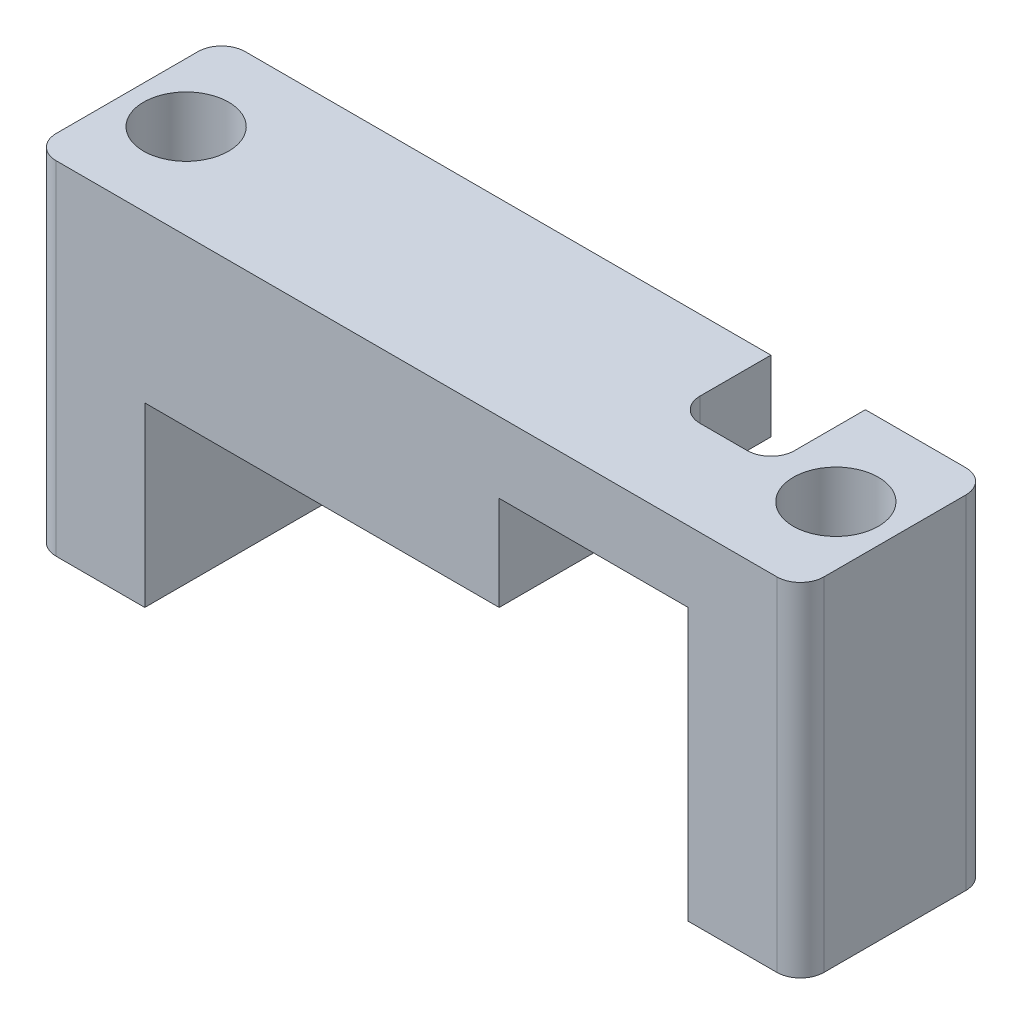
ISO-10303-21;
HEADER;
FILE_DESCRIPTION(('STEP AP214'),'2;1');
FILE_NAME('part.step','',(''),(''),'','','');
FILE_SCHEMA(('AUTOMOTIVE_DESIGN { 1 0 10303 214 1 1 1 1 }'));
ENDSEC;
DATA;
#1=APPLICATION_CONTEXT('core data for automotive mechanical design processes');
#2=APPLICATION_PROTOCOL_DEFINITION('international standard','automotive_design',2000,#1);
#3=PRODUCT_CONTEXT('',#1,'mechanical');
#4=PRODUCT('Part','Part','',(#3));
#5=PRODUCT_RELATED_PRODUCT_CATEGORY('part','',(#4));
#6=PRODUCT_DEFINITION_FORMATION('','',#4);
#7=PRODUCT_DEFINITION_CONTEXT('part definition',#1,'design');
#8=PRODUCT_DEFINITION('design','',#6,#7);
#9=PRODUCT_DEFINITION_SHAPE('','',#8);
#10=(LENGTH_UNIT() NAMED_UNIT(*) SI_UNIT(.MILLI.,.METRE.));
#11=(NAMED_UNIT(*) PLANE_ANGLE_UNIT() SI_UNIT($,.RADIAN.));
#12=(NAMED_UNIT(*) SI_UNIT($,.STERADIAN.) SOLID_ANGLE_UNIT());
#13=UNCERTAINTY_MEASURE_WITH_UNIT(LENGTH_MEASURE(1.E-05),#10,'distance_accuracy_value','');
#14=(GEOMETRIC_REPRESENTATION_CONTEXT(3) GLOBAL_UNCERTAINTY_ASSIGNED_CONTEXT((#13)) GLOBAL_UNIT_ASSIGNED_CONTEXT((#10,
#11,#12)) REPRESENTATION_CONTEXT('',''));
#15=CARTESIAN_POINT('',(0.,0.,0.));
#16=DIRECTION('',(0.,0.,1.));
#17=DIRECTION('',(1.,0.,0.));
#18=AXIS2_PLACEMENT_3D('',#15,#16,#17);
#19=CARTESIAN_POINT('',(0.,0.,0.));
#20=DIRECTION('',(0.,0.,1.));
#21=DIRECTION('',(1.,0.,0.));
#22=AXIS2_PLACEMENT_3D('',#19,#20,#21);
#23=PLANE('',#22);
#24=DIRECTION('',(1.,0.,0.));
#25=VECTOR('',#24,1.);
#26=CARTESIAN_POINT('',(3.5,4.,0.));
#27=LINE('',#26,#25);
#28=CARTESIAN_POINT('',(11.,4.,0.));
#29=VERTEX_POINT('',#28);
#30=CARTESIAN_POINT('',(11.5,4.,0.));
#31=VERTEX_POINT('',#30);
#32=EDGE_CURVE('E208',#29,#31,#27,.T.);
#33=ORIENTED_EDGE('',*,*,#32,.F.);
#34=DIRECTION('',(0.,-1.,0.));
#35=VECTOR('',#34,1.);
#36=CARTESIAN_POINT('',(11.,6.99999999999999,0.));
#37=LINE('',#36,#35);
#38=CARTESIAN_POINT('',(11.,6.99999999999999,0.));
#39=VERTEX_POINT('',#38);
#40=EDGE_CURVE('E305',#39,#29,#37,.T.);
#41=ORIENTED_EDGE('',*,*,#40,.F.);
#42=DIRECTION('',(-1.,0.,0.));
#43=VECTOR('',#42,1.);
#44=CARTESIAN_POINT('',(16.25,6.99999999999999,0.));
#45=LINE('',#44,#43);
#46=CARTESIAN_POINT('',(15.25,6.99999999999999,0.));
#47=VERTEX_POINT('',#46);
#48=EDGE_CURVE('E190',#47,#39,#45,.T.);
#49=ORIENTED_EDGE('',*,*,#48,.F.);
#50=DIRECTION('',(0.,1.,0.));
#51=VECTOR('',#50,1.);
#52=CARTESIAN_POINT('',(15.25,0.,0.));
#53=LINE('',#52,#51);
#54=CARTESIAN_POINT('',(15.25,-7.50000000000001,0.));
#55=VERTEX_POINT('',#54);
#56=EDGE_CURVE('E261',#47,#55,#53,.F.);
#57=ORIENTED_EDGE('',*,*,#56,.T.);
#58=DIRECTION('',(1.,0.,0.));
#59=VECTOR('',#58,1.);
#60=CARTESIAN_POINT('',(11.5,-7.50000000000001,0.));
#61=LINE('',#60,#59);
#62=CARTESIAN_POINT('',(11.5,-7.50000000000001,0.));
#63=VERTEX_POINT('',#62);
#64=EDGE_CURVE('E213',#63,#55,#61,.T.);
#65=ORIENTED_EDGE('',*,*,#64,.F.);
#66=DIRECTION('',(0.,-1.,0.));
#67=VECTOR('',#66,1.);
#68=CARTESIAN_POINT('',(11.5,4.,0.));
#69=LINE('',#68,#67);
#70=EDGE_CURVE('E211',#31,#63,#69,.T.);
#71=ORIENTED_EDGE('',*,*,#70,.F.);
#72=EDGE_LOOP('',(#33,#41,#49,#57,#65,#71));
#73=FACE_BOUND('',#72,.T.);
#74=ADVANCED_FACE('F32',(#73),#23,.F.);
#75=CARTESIAN_POINT('',(16.25,6.99999999999999,8.00000000000001));
#76=DIRECTION('',(0.,-1.,0.));
#77=DIRECTION('',(0.,0.,-1.));
#78=AXIS2_PLACEMENT_3D('',#75,#76,#77);
#79=PLANE('',#78);
#80=ORIENTED_EDGE('',*,*,#48,.T.);
#81=DIRECTION('',(0.,0.,-1.));
#82=VECTOR('',#81,1.);
#83=CARTESIAN_POINT('',(11.,6.99999999999999,4.00000000000001));
#84=LINE('',#83,#82);
#85=CARTESIAN_POINT('',(11.,6.99999999999988,3.));
#86=VERTEX_POINT('',#85);
#87=EDGE_CURVE('E172',#86,#39,#84,.T.);
#88=ORIENTED_EDGE('',*,*,#87,.F.);
#89=CARTESIAN_POINT('',(9.99999999999999,6.99999999999988,3.));
#90=DIRECTION('',(0.,-1.,0.));
#91=DIRECTION('',(0.,0.,-1.));
#92=AXIS2_PLACEMENT_3D('',#89,#90,#91);
#93=CIRCLE('',#92,1.);
#94=CARTESIAN_POINT('',(9.99999999999999,6.99999999999999,4.00000000000001));
#95=VERTEX_POINT('',#94);
#96=EDGE_CURVE('E294',#86,#95,#93,.T.);
#97=ORIENTED_EDGE('',*,*,#96,.T.);
#98=DIRECTION('',(1.,0.,0.));
#99=VECTOR('',#98,1.);
#100=CARTESIAN_POINT('',(11.,6.99999999999999,4.00000000000001));
#101=LINE('',#100,#99);
#102=CARTESIAN_POINT('',(8.00000000000002,6.99999999999999,3.99999999999999));
#103=VERTEX_POINT('',#102);
#104=EDGE_CURVE('E173',#103,#95,#101,.T.);
#105=ORIENTED_EDGE('',*,*,#104,.F.);
#106=CARTESIAN_POINT('',(7.99999999999999,6.99999999999988,3.));
#107=DIRECTION('',(0.,-1.,0.));
#108=DIRECTION('',(0.,0.,-1.));
#109=AXIS2_PLACEMENT_3D('',#106,#107,#108);
#110=CIRCLE('',#109,1.);
#111=CARTESIAN_POINT('',(6.99999999999999,6.99999999999988,3.));
#112=VERTEX_POINT('',#111);
#113=EDGE_CURVE('E40',#103,#112,#110,.T.);
#114=ORIENTED_EDGE('',*,*,#113,.T.);
#115=DIRECTION('',(0.,0.,-1.));
#116=VECTOR('',#115,1.);
#117=CARTESIAN_POINT('',(7.00000000000002,6.99999999999999,4.));
#118=LINE('',#117,#116);
#119=CARTESIAN_POINT('',(7.00000000000001,6.99999999999999,0.));
#120=VERTEX_POINT('',#119);
#121=EDGE_CURVE('E164',#112,#120,#118,.T.);
#122=ORIENTED_EDGE('',*,*,#121,.T.);
#123=CARTESIAN_POINT('',(-15.25,6.99999999999999,0.));
#124=VERTEX_POINT('',#123);
#125=EDGE_CURVE('E170',#120,#124,#45,.T.);
#126=ORIENTED_EDGE('',*,*,#125,.T.);
#127=CARTESIAN_POINT('',(-15.25,6.99999999999999,1.));
#128=DIRECTION('',(0.,-1.,0.));
#129=DIRECTION('',(0.,0.,-1.));
#130=AXIS2_PLACEMENT_3D('',#127,#128,#129);
#131=CIRCLE('',#130,1.);
#132=CARTESIAN_POINT('',(-16.25,6.99999999999999,1.));
#133=VERTEX_POINT('',#132);
#134=EDGE_CURVE('E254',#124,#133,#131,.F.);
#135=ORIENTED_EDGE('',*,*,#134,.T.);
#136=DIRECTION('',(0.,0.,-1.));
#137=VECTOR('',#136,1.);
#138=CARTESIAN_POINT('',(-16.25,6.99999999999999,8.00000000000001));
#139=LINE('',#138,#137);
#140=CARTESIAN_POINT('',(-16.25,6.99999999999988,7.00000000000001));
#141=VERTEX_POINT('',#140);
#142=EDGE_CURVE('E241',#141,#133,#139,.T.);
#143=ORIENTED_EDGE('',*,*,#142,.F.);
#144=CARTESIAN_POINT('',(-15.25,6.99999999999988,7.00000000000001));
#145=DIRECTION('',(0.,-1.,0.));
#146=DIRECTION('',(0.,0.,-1.));
#147=AXIS2_PLACEMENT_3D('',#144,#145,#146);
#148=CIRCLE('',#147,1.);
#149=CARTESIAN_POINT('',(-15.25,6.99999999999999,8.00000000000001));
#150=VERTEX_POINT('',#149);
#151=EDGE_CURVE('E252',#141,#150,#148,.F.);
#152=ORIENTED_EDGE('',*,*,#151,.T.);
#153=DIRECTION('',(-1.,0.,0.));
#154=VECTOR('',#153,1.);
#155=CARTESIAN_POINT('',(16.25,6.99999999999999,8.00000000000001));
#156=LINE('',#155,#154);
#157=CARTESIAN_POINT('',(15.25,6.99999999999999,8.00000000000001));
#158=VERTEX_POINT('',#157);
#159=EDGE_CURVE('E216',#158,#150,#156,.T.);
#160=ORIENTED_EDGE('',*,*,#159,.F.);
#161=CARTESIAN_POINT('',(15.25,6.99999999999988,7.));
#162=DIRECTION('',(0.,-1.,0.));
#163=DIRECTION('',(0.,0.,-1.));
#164=AXIS2_PLACEMENT_3D('',#161,#162,#163);
#165=CIRCLE('',#164,1.);
#166=CARTESIAN_POINT('',(16.25,6.99999999999988,7.));
#167=VERTEX_POINT('',#166);
#168=EDGE_CURVE('E256',#158,#167,#165,.F.);
#169=ORIENTED_EDGE('',*,*,#168,.T.);
#170=DIRECTION('',(0.,0.,-1.));
#171=VECTOR('',#170,1.);
#172=CARTESIAN_POINT('',(16.25,6.99999999999999,8.00000000000001));
#173=LINE('',#172,#171);
#174=CARTESIAN_POINT('',(16.25,6.99999999999999,1.));
#175=VERTEX_POINT('',#174);
#176=EDGE_CURVE('E244',#167,#175,#173,.T.);
#177=ORIENTED_EDGE('',*,*,#176,.T.);
#178=CARTESIAN_POINT('',(15.25,6.99999999999999,1.));
#179=DIRECTION('',(0.,-1.,0.));
#180=DIRECTION('',(0.,0.,-1.));
#181=AXIS2_PLACEMENT_3D('',#178,#179,#180);
#182=CIRCLE('',#181,1.);
#183=EDGE_CURVE('E258',#175,#47,#182,.F.);
#184=ORIENTED_EDGE('',*,*,#183,.T.);
#185=EDGE_LOOP('',(#80,#88,#97,#105,#114,#122,#126,#135,#143,#152,#160,#169,#177,#184));
#186=FACE_BOUND('',#185,.T.);
#187=CARTESIAN_POINT('',(13.75,7.00000000000001,3.99999999999999));
#188=DIRECTION('',(0.,1.,0.));
#189=DIRECTION('',(0.,0.,1.));
#190=AXIS2_PLACEMENT_3D('',#187,#188,#189);
#191=CIRCLE('',#190,1.79999999999999);
#192=CARTESIAN_POINT('',(13.75,7.00000000000001,5.79999999999998));
#193=VERTEX_POINT('',#192);
#194=EDGE_CURVE('E317',#193,#193,#191,.T.);
#195=ORIENTED_EDGE('',*,*,#194,.F.);
#196=EDGE_LOOP('',(#195));
#197=FACE_BOUND('',#196,.T.);
#198=CARTESIAN_POINT('',(-13.75,7.00000000000001,4.));
#199=DIRECTION('',(0.,1.,0.));
#200=DIRECTION('',(0.,0.,1.));
#201=AXIS2_PLACEMENT_3D('',#198,#199,#200);
#202=CIRCLE('',#201,1.79999999999999);
#203=CARTESIAN_POINT('',(-13.75,7.00000000000001,5.79999999999999));
#204=VERTEX_POINT('',#203);
#205=EDGE_CURVE('E195',#204,#204,#202,.T.);
#206=ORIENTED_EDGE('',*,*,#205,.F.);
#207=EDGE_LOOP('',(#206));
#208=FACE_BOUND('',#207,.T.);
#209=ADVANCED_FACE('F167',(#186,#197,#208),#79,.F.);
#210=CARTESIAN_POINT('',(16.25,-7.50000000000001,8.00000000000001));
#211=DIRECTION('',(-1.,0.,0.));
#212=DIRECTION('',(0.,0.,1.));
#213=AXIS2_PLACEMENT_3D('',#210,#211,#212);
#214=PLANE('',#213);
#215=DIRECTION('',(0.,0.,-1.));
#216=VECTOR('',#215,1.);
#217=CARTESIAN_POINT('',(16.25,-7.50000000000001,8.00000000000001));
#218=LINE('',#217,#216);
#219=CARTESIAN_POINT('',(16.25,-7.50000000000012,7.));
#220=VERTEX_POINT('',#219);
#221=CARTESIAN_POINT('',(16.25,-7.50000000000001,1.));
#222=VERTEX_POINT('',#221);
#223=EDGE_CURVE('E217',#220,#222,#218,.T.);
#224=ORIENTED_EDGE('',*,*,#223,.T.);
#225=DIRECTION('',(0.,1.,0.));
#226=VECTOR('',#225,1.);
#227=CARTESIAN_POINT('',(16.25,-7.50000000000001,1.));
#228=LINE('',#227,#226);
#229=EDGE_CURVE('E249',#222,#175,#228,.T.);
#230=ORIENTED_EDGE('',*,*,#229,.T.);
#231=ORIENTED_EDGE('',*,*,#176,.F.);
#232=DIRECTION('',(0.,1.,0.));
#233=VECTOR('',#232,1.);
#234=CARTESIAN_POINT('',(16.25,-7.50000000000012,7.));
#235=LINE('',#234,#233);
#236=EDGE_CURVE('E247',#167,#220,#235,.F.);
#237=ORIENTED_EDGE('',*,*,#236,.T.);
#238=EDGE_LOOP('',(#224,#230,#231,#237));
#239=FACE_BOUND('',#238,.T.);
#240=ADVANCED_FACE('F355',(#239),#214,.F.);
#241=CARTESIAN_POINT('',(-16.25,6.99999999999999,8.00000000000001));
#242=DIRECTION('',(1.,0.,0.));
#243=DIRECTION('',(0.,0.,-1.));
#244=AXIS2_PLACEMENT_3D('',#241,#242,#243);
#245=PLANE('',#244);
#246=ORIENTED_EDGE('',*,*,#142,.T.);
#247=DIRECTION('',(0.,-1.,0.));
#248=VECTOR('',#247,1.);
#249=CARTESIAN_POINT('',(-16.25,6.99999999999999,1.));
#250=LINE('',#249,#248);
#251=CARTESIAN_POINT('',(-16.25,-7.50000000000001,1.));
#252=VERTEX_POINT('',#251);
#253=EDGE_CURVE('E275',#133,#252,#250,.T.);
#254=ORIENTED_EDGE('',*,*,#253,.T.);
#255=DIRECTION('',(0.,0.,-1.));
#256=VECTOR('',#255,1.);
#257=CARTESIAN_POINT('',(-16.25,-7.50000000000001,8.00000000000001));
#258=LINE('',#257,#256);
#259=CARTESIAN_POINT('',(-16.25,-7.50000000000012,7.00000000000001));
#260=VERTEX_POINT('',#259);
#261=EDGE_CURVE('E238',#260,#252,#258,.T.);
#262=ORIENTED_EDGE('',*,*,#261,.F.);
#263=DIRECTION('',(0.,-1.,0.));
#264=VECTOR('',#263,1.);
#265=CARTESIAN_POINT('',(-16.25,6.99999999999988,7.00000000000001));
#266=LINE('',#265,#264);
#267=EDGE_CURVE('E273',#260,#141,#266,.F.);
#268=ORIENTED_EDGE('',*,*,#267,.T.);
#269=EDGE_LOOP('',(#246,#254,#262,#268));
#270=FACE_BOUND('',#269,.T.);
#271=ADVANCED_FACE('F451',(#270),#245,.F.);
#272=CARTESIAN_POINT('',(-16.25,-7.50000000000001,8.00000000000001));
#273=DIRECTION('',(0.,1.,0.));
#274=DIRECTION('',(0.,0.,1.));
#275=AXIS2_PLACEMENT_3D('',#272,#273,#274);
#276=PLANE('',#275);
#277=CARTESIAN_POINT('',(-13.75,-7.50000000000001,4.));
#278=DIRECTION('',(0.,1.,0.));
#279=DIRECTION('',(0.,0.,1.));
#280=AXIS2_PLACEMENT_3D('',#277,#278,#279);
#281=CIRCLE('',#280,1.79999999999999);
#282=CARTESIAN_POINT('',(-13.75,-7.50000000000001,5.8));
#283=VERTEX_POINT('',#282);
#284=EDGE_CURVE('E191',#283,#283,#281,.T.);
#285=ORIENTED_EDGE('',*,*,#284,.T.);
#286=EDGE_LOOP('',(#285));
#287=FACE_BOUND('',#286,.T.);
#288=ORIENTED_EDGE('',*,*,#261,.T.);
#289=CARTESIAN_POINT('',(-15.25,-7.50000000000001,1.));
#290=DIRECTION('',(0.,1.,0.));
#291=DIRECTION('',(0.,0.,1.));
#292=AXIS2_PLACEMENT_3D('',#289,#290,#291);
#293=CIRCLE('',#292,1.);
#294=CARTESIAN_POINT('',(-15.25,-7.50000000000001,0.));
#295=VERTEX_POINT('',#294);
#296=EDGE_CURVE('E183',#252,#295,#293,.F.);
#297=ORIENTED_EDGE('',*,*,#296,.T.);
#298=DIRECTION('',(1.,0.,0.));
#299=VECTOR('',#298,1.);
#300=CARTESIAN_POINT('',(-16.25,-7.50000000000001,0.));
#301=LINE('',#300,#299);
#302=CARTESIAN_POINT('',(-11.5,-7.50000000000001,0.));
#303=VERTEX_POINT('',#302);
#304=EDGE_CURVE('E193',#295,#303,#301,.T.);
#305=ORIENTED_EDGE('',*,*,#304,.T.);
#306=DIRECTION('',(0.,0.,-1.));
#307=VECTOR('',#306,1.);
#308=CARTESIAN_POINT('',(-11.5,-7.50000000000001,8.00000000000001));
#309=LINE('',#308,#307);
#310=CARTESIAN_POINT('',(-11.5,-7.50000000000001,8.00000000000001));
#311=VERTEX_POINT('',#310);
#312=EDGE_CURVE('E235',#311,#303,#309,.T.);
#313=ORIENTED_EDGE('',*,*,#312,.F.);
#314=DIRECTION('',(1.,0.,0.));
#315=VECTOR('',#314,1.);
#316=CARTESIAN_POINT('',(-16.25,-7.50000000000001,8.00000000000001));
#317=LINE('',#316,#315);
#318=CARTESIAN_POINT('',(-15.25,-7.50000000000001,8.00000000000001));
#319=VERTEX_POINT('',#318);
#320=EDGE_CURVE('E330',#319,#311,#317,.T.);
#321=ORIENTED_EDGE('',*,*,#320,.F.);
#322=CARTESIAN_POINT('',(-15.25,-7.50000000000012,7.00000000000001));
#323=DIRECTION('',(0.,1.,0.));
#324=DIRECTION('',(0.,0.,1.));
#325=AXIS2_PLACEMENT_3D('',#322,#323,#324);
#326=CIRCLE('',#325,1.);
#327=EDGE_CURVE('E278',#319,#260,#326,.F.);
#328=ORIENTED_EDGE('',*,*,#327,.T.);
#329=EDGE_LOOP('',(#288,#297,#305,#313,#321,#328));
#330=FACE_BOUND('',#329,.T.);
#331=ADVANCED_FACE('F456',(#287,#330),#276,.F.);
#332=CARTESIAN_POINT('',(-11.5,-7.50000000000001,8.00000000000001));
#333=DIRECTION('',(-1.,0.,0.));
#334=DIRECTION('',(0.,-1.,0.));
#335=AXIS2_PLACEMENT_3D('',#332,#333,#334);
#336=PLANE('',#335);
#337=DIRECTION('',(0.,1.,0.));
#338=VECTOR('',#337,1.);
#339=CARTESIAN_POINT('',(-11.5,-7.50000000000001,0.));
#340=LINE('',#339,#338);
#341=CARTESIAN_POINT('',(-11.5,0.,0.));
#342=VERTEX_POINT('',#341);
#343=EDGE_CURVE('E202',#303,#342,#340,.T.);
#344=ORIENTED_EDGE('',*,*,#343,.T.);
#345=DIRECTION('',(0.,0.,-1.));
#346=VECTOR('',#345,1.);
#347=CARTESIAN_POINT('',(-11.5,0.,8.00000000000001));
#348=LINE('',#347,#346);
#349=CARTESIAN_POINT('',(-11.5,0.,8.00000000000001));
#350=VERTEX_POINT('',#349);
#351=EDGE_CURVE('E232',#350,#342,#348,.T.);
#352=ORIENTED_EDGE('',*,*,#351,.F.);
#353=DIRECTION('',(0.,1.,0.));
#354=VECTOR('',#353,1.);
#355=CARTESIAN_POINT('',(-11.5,-7.50000000000001,8.00000000000001));
#356=LINE('',#355,#354);
#357=EDGE_CURVE('E332',#311,#350,#356,.T.);
#358=ORIENTED_EDGE('',*,*,#357,.F.);
#359=ORIENTED_EDGE('',*,*,#312,.T.);
#360=EDGE_LOOP('',(#344,#352,#358,#359));
#361=FACE_BOUND('',#360,.T.);
#362=ADVANCED_FACE('F445',(#361),#336,.F.);
#363=CARTESIAN_POINT('',(-11.5,0.,8.00000000000001));
#364=DIRECTION('',(0.,1.,0.));
#365=DIRECTION('',(0.,0.,1.));
#366=AXIS2_PLACEMENT_3D('',#363,#364,#365);
#367=PLANE('',#366);
#368=DIRECTION('',(1.,0.,0.));
#369=VECTOR('',#368,1.);
#370=CARTESIAN_POINT('',(-11.5,0.,0.));
#371=LINE('',#370,#369);
#372=CARTESIAN_POINT('',(3.5,0.,0.));
#373=VERTEX_POINT('',#372);
#374=EDGE_CURVE('E204',#342,#373,#371,.T.);
#375=ORIENTED_EDGE('',*,*,#374,.T.);
#376=DIRECTION('',(0.,0.,-1.));
#377=VECTOR('',#376,1.);
#378=CARTESIAN_POINT('',(3.5,0.,8.00000000000001));
#379=LINE('',#378,#377);
#380=CARTESIAN_POINT('',(3.5,0.,8.00000000000001));
#381=VERTEX_POINT('',#380);
#382=EDGE_CURVE('E229',#381,#373,#379,.T.);
#383=ORIENTED_EDGE('',*,*,#382,.F.);
#384=DIRECTION('',(1.,0.,0.));
#385=VECTOR('',#384,1.);
#386=CARTESIAN_POINT('',(-11.5,0.,8.00000000000001));
#387=LINE('',#386,#385);
#388=EDGE_CURVE('E334',#350,#381,#387,.T.);
#389=ORIENTED_EDGE('',*,*,#388,.F.);
#390=ORIENTED_EDGE('',*,*,#351,.T.);
#391=EDGE_LOOP('',(#375,#383,#389,#390));
#392=FACE_BOUND('',#391,.T.);
#393=ADVANCED_FACE('F441',(#392),#367,.F.);
#394=CARTESIAN_POINT('',(3.5,0.,8.00000000000001));
#395=DIRECTION('',(-1.,0.,0.));
#396=DIRECTION('',(0.,-1.,0.));
#397=AXIS2_PLACEMENT_3D('',#394,#395,#396);
#398=PLANE('',#397);
#399=DIRECTION('',(0.,1.,0.));
#400=VECTOR('',#399,1.);
#401=CARTESIAN_POINT('',(3.5,0.,0.));
#402=LINE('',#401,#400);
#403=CARTESIAN_POINT('',(3.5,4.,0.));
#404=VERTEX_POINT('',#403);
#405=EDGE_CURVE('E206',#373,#404,#402,.T.);
#406=ORIENTED_EDGE('',*,*,#405,.T.);
#407=DIRECTION('',(0.,0.,-1.));
#408=VECTOR('',#407,1.);
#409=CARTESIAN_POINT('',(3.5,4.,8.00000000000001));
#410=LINE('',#409,#408);
#411=CARTESIAN_POINT('',(3.5,4.,8.00000000000001));
#412=VERTEX_POINT('',#411);
#413=EDGE_CURVE('E226',#412,#404,#410,.T.);
#414=ORIENTED_EDGE('',*,*,#413,.F.);
#415=DIRECTION('',(0.,1.,0.));
#416=VECTOR('',#415,1.);
#417=CARTESIAN_POINT('',(3.5,0.,8.00000000000001));
#418=LINE('',#417,#416);
#419=EDGE_CURVE('E336',#381,#412,#418,.T.);
#420=ORIENTED_EDGE('',*,*,#419,.F.);
#421=ORIENTED_EDGE('',*,*,#382,.T.);
#422=EDGE_LOOP('',(#406,#414,#420,#421));
#423=FACE_BOUND('',#422,.T.);
#424=ADVANCED_FACE('F436',(#423),#398,.F.);
#425=CARTESIAN_POINT('',(3.5,4.,8.00000000000001));
#426=DIRECTION('',(0.,1.,0.));
#427=DIRECTION('',(0.,0.,1.));
#428=AXIS2_PLACEMENT_3D('',#425,#426,#427);
#429=PLANE('',#428);
#430=DIRECTION('',(-1.,0.,0.));
#431=VECTOR('',#430,1.);
#432=CARTESIAN_POINT('',(3.50000000000002,4.,4.));
#433=LINE('',#432,#431);
#434=CARTESIAN_POINT('',(9.99999999999999,4.,4.00000000000001));
#435=VERTEX_POINT('',#434);
#436=CARTESIAN_POINT('',(8.00000000000002,4.,3.99999999999999));
#437=VERTEX_POINT('',#436);
#438=EDGE_CURVE('E182',#435,#437,#433,.T.);
#439=ORIENTED_EDGE('',*,*,#438,.F.);
#440=CARTESIAN_POINT('',(9.99999999999999,3.99999999999989,3.));
#441=DIRECTION('',(0.,1.,0.));
#442=DIRECTION('',(0.,0.,1.));
#443=AXIS2_PLACEMENT_3D('',#440,#441,#442);
#444=CIRCLE('',#443,1.);
#445=CARTESIAN_POINT('',(11.,3.99999999999989,3.));
#446=VERTEX_POINT('',#445);
#447=EDGE_CURVE('E292',#435,#446,#444,.T.);
#448=ORIENTED_EDGE('',*,*,#447,.T.);
#449=DIRECTION('',(0.,0.,-1.));
#450=VECTOR('',#449,1.);
#451=CARTESIAN_POINT('',(11.,4.,8.00000000000001));
#452=LINE('',#451,#450);
#453=EDGE_CURVE('E311',#446,#29,#452,.T.);
#454=ORIENTED_EDGE('',*,*,#453,.T.);
#455=ORIENTED_EDGE('',*,*,#32,.T.);
#456=DIRECTION('',(0.,0.,-1.));
#457=VECTOR('',#456,1.);
#458=CARTESIAN_POINT('',(11.5,4.,8.00000000000001));
#459=LINE('',#458,#457);
#460=CARTESIAN_POINT('',(11.5,4.,8.00000000000001));
#461=VERTEX_POINT('',#460);
#462=EDGE_CURVE('E223',#461,#31,#459,.T.);
#463=ORIENTED_EDGE('',*,*,#462,.F.);
#464=DIRECTION('',(1.,0.,0.));
#465=VECTOR('',#464,1.);
#466=CARTESIAN_POINT('',(3.5,4.,8.00000000000001));
#467=LINE('',#466,#465);
#468=EDGE_CURVE('E338',#412,#461,#467,.T.);
#469=ORIENTED_EDGE('',*,*,#468,.F.);
#470=ORIENTED_EDGE('',*,*,#413,.T.);
#471=CARTESIAN_POINT('',(7.00000000000001,4.,0.));
#472=VERTEX_POINT('',#471);
#473=EDGE_CURVE('E209',#404,#472,#27,.T.);
#474=ORIENTED_EDGE('',*,*,#473,.T.);
#475=DIRECTION('',(0.,0.,1.));
#476=VECTOR('',#475,1.);
#477=CARTESIAN_POINT('',(7.00000000000001,4.,8.00000000000001));
#478=LINE('',#477,#476);
#479=CARTESIAN_POINT('',(6.99999999999999,3.99999999999989,3.00000000000001));
#480=VERTEX_POINT('',#479);
#481=EDGE_CURVE('E178',#472,#480,#478,.T.);
#482=ORIENTED_EDGE('',*,*,#481,.T.);
#483=CARTESIAN_POINT('',(7.99999999999999,3.99999999999989,3.00000000000001));
#484=DIRECTION('',(0.,1.,0.));
#485=DIRECTION('',(0.,0.,1.));
#486=AXIS2_PLACEMENT_3D('',#483,#484,#485);
#487=CIRCLE('',#486,1.);
#488=EDGE_CURVE('E11',#480,#437,#487,.T.);
#489=ORIENTED_EDGE('',*,*,#488,.T.);
#490=EDGE_LOOP('',(#439,#448,#454,#455,#463,#469,#470,#474,#482,#489));
#491=FACE_BOUND('',#490,.T.);
#492=ADVANCED_FACE('F310',(#491),#429,.F.);
#493=CARTESIAN_POINT('',(11.5,4.,8.00000000000001));
#494=DIRECTION('',(1.,0.,0.));
#495=DIRECTION('',(0.,1.,0.));
#496=AXIS2_PLACEMENT_3D('',#493,#494,#495);
#497=PLANE('',#496);
#498=ORIENTED_EDGE('',*,*,#70,.T.);
#499=DIRECTION('',(0.,0.,-1.));
#500=VECTOR('',#499,1.);
#501=CARTESIAN_POINT('',(11.5,-7.50000000000001,8.00000000000001));
#502=LINE('',#501,#500);
#503=CARTESIAN_POINT('',(11.5,-7.50000000000001,8.00000000000001));
#504=VERTEX_POINT('',#503);
#505=EDGE_CURVE('E220',#504,#63,#502,.T.);
#506=ORIENTED_EDGE('',*,*,#505,.F.);
#507=DIRECTION('',(0.,-1.,0.));
#508=VECTOR('',#507,1.);
#509=CARTESIAN_POINT('',(11.5,4.,8.00000000000001));
#510=LINE('',#509,#508);
#511=EDGE_CURVE('E339',#461,#504,#510,.T.);
#512=ORIENTED_EDGE('',*,*,#511,.F.);
#513=ORIENTED_EDGE('',*,*,#462,.T.);
#514=EDGE_LOOP('',(#498,#506,#512,#513));
#515=FACE_BOUND('',#514,.T.);
#516=ADVANCED_FACE('F371',(#515),#497,.F.);
#517=CARTESIAN_POINT('',(11.5,-7.50000000000001,8.00000000000001));
#518=DIRECTION('',(0.,1.,0.));
#519=DIRECTION('',(0.,0.,1.));
#520=AXIS2_PLACEMENT_3D('',#517,#518,#519);
#521=PLANE('',#520);
#522=CARTESIAN_POINT('',(13.75,-7.50000000000001,3.99999999999999));
#523=DIRECTION('',(0.,1.,0.));
#524=DIRECTION('',(0.,0.,1.));
#525=AXIS2_PLACEMENT_3D('',#522,#523,#524);
#526=CIRCLE('',#525,1.79999999999999);
#527=CARTESIAN_POINT('',(13.75,-7.50000000000001,5.79999999999999));
#528=VERTEX_POINT('',#527);
#529=EDGE_CURVE('E320',#528,#528,#526,.T.);
#530=ORIENTED_EDGE('',*,*,#529,.T.);
#531=EDGE_LOOP('',(#530));
#532=FACE_BOUND('',#531,.T.);
#533=ORIENTED_EDGE('',*,*,#64,.T.);
#534=CARTESIAN_POINT('',(15.25,-7.50000000000001,1.));
#535=DIRECTION('',(0.,1.,0.));
#536=DIRECTION('',(0.,0.,1.));
#537=AXIS2_PLACEMENT_3D('',#534,#535,#536);
#538=CIRCLE('',#537,1.);
#539=EDGE_CURVE('E265',#55,#222,#538,.F.);
#540=ORIENTED_EDGE('',*,*,#539,.T.);
#541=ORIENTED_EDGE('',*,*,#223,.F.);
#542=CARTESIAN_POINT('',(15.25,-7.50000000000012,7.));
#543=DIRECTION('',(0.,1.,0.));
#544=DIRECTION('',(0.,0.,1.));
#545=AXIS2_PLACEMENT_3D('',#542,#543,#544);
#546=CIRCLE('',#545,1.);
#547=CARTESIAN_POINT('',(15.25,-7.50000000000001,8.00000000000001));
#548=VERTEX_POINT('',#547);
#549=EDGE_CURVE('E263',#220,#548,#546,.F.);
#550=ORIENTED_EDGE('',*,*,#549,.T.);
#551=DIRECTION('',(1.,0.,0.));
#552=VECTOR('',#551,1.);
#553=CARTESIAN_POINT('',(11.5,-7.50000000000001,8.00000000000001));
#554=LINE('',#553,#552);
#555=EDGE_CURVE('E199',#504,#548,#554,.T.);
#556=ORIENTED_EDGE('',*,*,#555,.F.);
#557=ORIENTED_EDGE('',*,*,#505,.T.);
#558=EDGE_LOOP('',(#533,#540,#541,#550,#556,#557));
#559=FACE_BOUND('',#558,.T.);
#560=ADVANCED_FACE('F372',(#532,#559),#521,.F.);
#561=CARTESIAN_POINT('',(0.,0.,8.00000000000001));
#562=DIRECTION('',(0.,0.,1.));
#563=DIRECTION('',(1.,0.,0.));
#564=AXIS2_PLACEMENT_3D('',#561,#562,#563);
#565=PLANE('',#564);
#566=ORIENTED_EDGE('',*,*,#555,.T.);
#567=DIRECTION('',(0.,1.,0.));
#568=VECTOR('',#567,1.);
#569=CARTESIAN_POINT('',(15.25,6.99999999999999,8.00000000000001));
#570=LINE('',#569,#568);
#571=EDGE_CURVE('E270',#548,#158,#570,.T.);
#572=ORIENTED_EDGE('',*,*,#571,.T.);
#573=ORIENTED_EDGE('',*,*,#159,.T.);
#574=DIRECTION('',(0.,-1.,0.));
#575=VECTOR('',#574,1.);
#576=CARTESIAN_POINT('',(-15.25,-7.50000000000001,8.00000000000001));
#577=LINE('',#576,#575);
#578=EDGE_CURVE('E267',#150,#319,#577,.T.);
#579=ORIENTED_EDGE('',*,*,#578,.T.);
#580=ORIENTED_EDGE('',*,*,#320,.T.);
#581=ORIENTED_EDGE('',*,*,#357,.T.);
#582=ORIENTED_EDGE('',*,*,#388,.T.);
#583=ORIENTED_EDGE('',*,*,#419,.T.);
#584=ORIENTED_EDGE('',*,*,#468,.T.);
#585=ORIENTED_EDGE('',*,*,#511,.T.);
#586=EDGE_LOOP('',(#566,#572,#573,#579,#580,#581,#582,#583,#584,#585));
#587=FACE_BOUND('',#586,.T.);
#588=ADVANCED_FACE('F346',(#587),#565,.T.);
#589=ORIENTED_EDGE('',*,*,#125,.F.);
#590=DIRECTION('',(0.,-1.,0.));
#591=VECTOR('',#590,1.);
#592=CARTESIAN_POINT('',(7.00000000000001,0.,0.));
#593=LINE('',#592,#591);
#594=EDGE_CURVE('E176',#120,#472,#593,.T.);
#595=ORIENTED_EDGE('',*,*,#594,.T.);
#596=ORIENTED_EDGE('',*,*,#473,.F.);
#597=ORIENTED_EDGE('',*,*,#405,.F.);
#598=ORIENTED_EDGE('',*,*,#374,.F.);
#599=ORIENTED_EDGE('',*,*,#343,.F.);
#600=ORIENTED_EDGE('',*,*,#304,.F.);
#601=DIRECTION('',(0.,-1.,0.));
#602=VECTOR('',#601,1.);
#603=CARTESIAN_POINT('',(-15.25,0.,0.));
#604=LINE('',#603,#602);
#605=EDGE_CURVE('E188',#295,#124,#604,.F.);
#606=ORIENTED_EDGE('',*,*,#605,.T.);
#607=EDGE_LOOP('',(#589,#595,#596,#597,#598,#599,#600,#606));
#608=FACE_BOUND('',#607,.T.);
#609=ADVANCED_FACE('F185',(#608),#23,.F.);
#610=CARTESIAN_POINT('',(-13.75,6.99999999999999,4.));
#611=DIRECTION('',(0.,1.,0.));
#612=DIRECTION('',(0.,0.,1.));
#613=AXIS2_PLACEMENT_3D('',#610,#611,#612);
#614=CYLINDRICAL_SURFACE('',#613,1.79999999999999);
#615=ORIENTED_EDGE('',*,*,#284,.F.);
#616=EDGE_LOOP('',(#615));
#617=FACE_BOUND('',#616,.T.);
#618=ORIENTED_EDGE('',*,*,#205,.T.);
#619=EDGE_LOOP('',(#618));
#620=FACE_BOUND('',#619,.T.);
#621=ADVANCED_FACE('F389',(#617,#620),#614,.F.);
#622=CARTESIAN_POINT('',(13.75,6.99999999999999,3.99999999999999));
#623=DIRECTION('',(0.,1.,0.));
#624=DIRECTION('',(0.,0.,1.));
#625=AXIS2_PLACEMENT_3D('',#622,#623,#624);
#626=CYLINDRICAL_SURFACE('',#625,1.79999999999999);
#627=ORIENTED_EDGE('',*,*,#529,.F.);
#628=EDGE_LOOP('',(#627));
#629=FACE_BOUND('',#628,.T.);
#630=ORIENTED_EDGE('',*,*,#194,.T.);
#631=EDGE_LOOP('',(#630));
#632=FACE_BOUND('',#631,.T.);
#633=ADVANCED_FACE('F393',(#629,#632),#626,.F.);
#634=CARTESIAN_POINT('',(15.25,-7.50000000000001,1.));
#635=DIRECTION('',(0.,1.,0.));
#636=DIRECTION('',(0.,0.,1.));
#637=AXIS2_PLACEMENT_3D('',#634,#635,#636);
#638=CYLINDRICAL_SURFACE('',#637,1.);
#639=ORIENTED_EDGE('',*,*,#539,.F.);
#640=ORIENTED_EDGE('',*,*,#56,.F.);
#641=ORIENTED_EDGE('',*,*,#183,.F.);
#642=ORIENTED_EDGE('',*,*,#229,.F.);
#643=EDGE_LOOP('',(#639,#640,#641,#642));
#644=FACE_BOUND('',#643,.T.);
#645=ADVANCED_FACE('F360',(#644),#638,.T.);
#646=CARTESIAN_POINT('',(15.25,-1.11022302462516E-13,7.));
#647=DIRECTION('',(0.,-1.,0.));
#648=DIRECTION('',(0.,0.,-1.));
#649=AXIS2_PLACEMENT_3D('',#646,#647,#648);
#650=CYLINDRICAL_SURFACE('',#649,1.);
#651=ORIENTED_EDGE('',*,*,#549,.F.);
#652=ORIENTED_EDGE('',*,*,#236,.F.);
#653=ORIENTED_EDGE('',*,*,#168,.F.);
#654=ORIENTED_EDGE('',*,*,#571,.F.);
#655=EDGE_LOOP('',(#651,#652,#653,#654));
#656=FACE_BOUND('',#655,.T.);
#657=ADVANCED_FACE('F351',(#656),#650,.T.);
#658=CARTESIAN_POINT('',(-15.25,6.99999999999999,1.));
#659=DIRECTION('',(0.,-1.,0.));
#660=DIRECTION('',(0.,0.,-1.));
#661=AXIS2_PLACEMENT_3D('',#658,#659,#660);
#662=CYLINDRICAL_SURFACE('',#661,1.);
#663=ORIENTED_EDGE('',*,*,#134,.F.);
#664=ORIENTED_EDGE('',*,*,#605,.F.);
#665=ORIENTED_EDGE('',*,*,#296,.F.);
#666=ORIENTED_EDGE('',*,*,#253,.F.);
#667=EDGE_LOOP('',(#663,#664,#665,#666));
#668=FACE_BOUND('',#667,.T.);
#669=ADVANCED_FACE('F413',(#668),#662,.T.);
#670=CARTESIAN_POINT('',(-15.25,-1.11022302462516E-13,7.00000000000001));
#671=DIRECTION('',(0.,1.,0.));
#672=DIRECTION('',(0.,0.,1.));
#673=AXIS2_PLACEMENT_3D('',#670,#671,#672);
#674=CYLINDRICAL_SURFACE('',#673,1.);
#675=ORIENTED_EDGE('',*,*,#151,.F.);
#676=ORIENTED_EDGE('',*,*,#267,.F.);
#677=ORIENTED_EDGE('',*,*,#327,.F.);
#678=ORIENTED_EDGE('',*,*,#578,.F.);
#679=EDGE_LOOP('',(#675,#676,#677,#678));
#680=FACE_BOUND('',#679,.T.);
#681=ADVANCED_FACE('F409',(#680),#674,.T.);
#682=CARTESIAN_POINT('',(0.,0.,4.));
#683=DIRECTION('',(0.,0.,-1.));
#684=DIRECTION('',(-1.,0.,0.));
#685=AXIS2_PLACEMENT_3D('',#682,#683,#684);
#686=PLANE('',#685);
#687=ORIENTED_EDGE('',*,*,#104,.T.);
#688=DIRECTION('',(0.,-1.,0.));
#689=VECTOR('',#688,1.);
#690=CARTESIAN_POINT('',(9.99999999999999,0.,4.00000000000001));
#691=LINE('',#690,#689);
#692=EDGE_CURVE('E286',#95,#435,#691,.T.);
#693=ORIENTED_EDGE('',*,*,#692,.T.);
#694=ORIENTED_EDGE('',*,*,#438,.T.);
#695=DIRECTION('',(0.,1.,0.));
#696=VECTOR('',#695,1.);
#697=CARTESIAN_POINT('',(8.00000000000002,0.,3.99999999999999));
#698=LINE('',#697,#696);
#699=EDGE_CURVE('E283',#437,#103,#698,.T.);
#700=ORIENTED_EDGE('',*,*,#699,.T.);
#701=EDGE_LOOP('',(#687,#693,#694,#700));
#702=FACE_BOUND('',#701,.T.);
#703=ADVANCED_FACE('F302',(#702),#686,.T.);
#704=CARTESIAN_POINT('',(11.,6.99999999999999,4.00000000000001));
#705=DIRECTION('',(1.,0.,0.));
#706=DIRECTION('',(0.,0.,-1.));
#707=AXIS2_PLACEMENT_3D('',#704,#705,#706);
#708=PLANE('',#707);
#709=ORIENTED_EDGE('',*,*,#453,.F.);
#710=DIRECTION('',(0.,-1.,0.));
#711=VECTOR('',#710,1.);
#712=CARTESIAN_POINT('',(11.,6.99999999999988,3.));
#713=LINE('',#712,#711);
#714=EDGE_CURVE('E289',#446,#86,#713,.F.);
#715=ORIENTED_EDGE('',*,*,#714,.T.);
#716=ORIENTED_EDGE('',*,*,#87,.T.);
#717=ORIENTED_EDGE('',*,*,#40,.T.);
#718=EDGE_LOOP('',(#709,#715,#716,#717));
#719=FACE_BOUND('',#718,.T.);
#720=ADVANCED_FACE('F314',(#719),#708,.F.);
#721=CARTESIAN_POINT('',(7.00000000000002,6.99999999999999,4.));
#722=DIRECTION('',(-1.,0.,0.));
#723=DIRECTION('',(0.,0.,1.));
#724=AXIS2_PLACEMENT_3D('',#721,#722,#723);
#725=PLANE('',#724);
#726=ORIENTED_EDGE('',*,*,#121,.F.);
#727=DIRECTION('',(0.,1.,0.));
#728=VECTOR('',#727,1.);
#729=CARTESIAN_POINT('',(6.99999999999999,6.99999999999988,3.));
#730=LINE('',#729,#728);
#731=EDGE_CURVE('E47',#112,#480,#730,.F.);
#732=ORIENTED_EDGE('',*,*,#731,.T.);
#733=ORIENTED_EDGE('',*,*,#481,.F.);
#734=ORIENTED_EDGE('',*,*,#594,.F.);
#735=EDGE_LOOP('',(#726,#732,#733,#734));
#736=FACE_BOUND('',#735,.T.);
#737=ADVANCED_FACE('F177',(#736),#725,.F.);
#738=CARTESIAN_POINT('',(9.99999999999999,-1.11022302462516E-13,3.));
#739=DIRECTION('',(0.,-1.,0.));
#740=DIRECTION('',(0.,0.,-1.));
#741=AXIS2_PLACEMENT_3D('',#738,#739,#740);
#742=CYLINDRICAL_SURFACE('',#741,1.);
#743=ORIENTED_EDGE('',*,*,#96,.F.);
#744=ORIENTED_EDGE('',*,*,#714,.F.);
#745=ORIENTED_EDGE('',*,*,#447,.F.);
#746=ORIENTED_EDGE('',*,*,#692,.F.);
#747=EDGE_LOOP('',(#743,#744,#745,#746));
#748=FACE_BOUND('',#747,.T.);
#749=ADVANCED_FACE('F307',(#748),#742,.F.);
#750=CARTESIAN_POINT('',(7.99999999999999,-1.11022302462516E-13,3.00000000000001));
#751=DIRECTION('',(0.,1.,0.));
#752=DIRECTION('',(0.,0.,1.));
#753=AXIS2_PLACEMENT_3D('',#750,#751,#752);
#754=CYLINDRICAL_SURFACE('',#753,1.);
#755=ORIENTED_EDGE('',*,*,#488,.F.);
#756=ORIENTED_EDGE('',*,*,#731,.F.);
#757=ORIENTED_EDGE('',*,*,#113,.F.);
#758=ORIENTED_EDGE('',*,*,#699,.F.);
#759=EDGE_LOOP('',(#755,#756,#757,#758));
#760=FACE_BOUND('',#759,.T.);
#761=ADVANCED_FACE('F34',(#760),#754,.F.);
#762=CLOSED_SHELL('',(#74,#209,#240,#271,#331,#362,#393,#424,#492,#516,#560,#588,#609,#621,#633,
#645,#657,#669,#681,#703,#720,#737,#749,#761));
#763=MANIFOLD_SOLID_BREP('B2',#762);
#764=ADVANCED_BREP_SHAPE_REPRESENTATION('',(#18,#763),#14);
#765=SHAPE_DEFINITION_REPRESENTATION(#9,#764);
ENDSEC;
END-ISO-10303-21;
